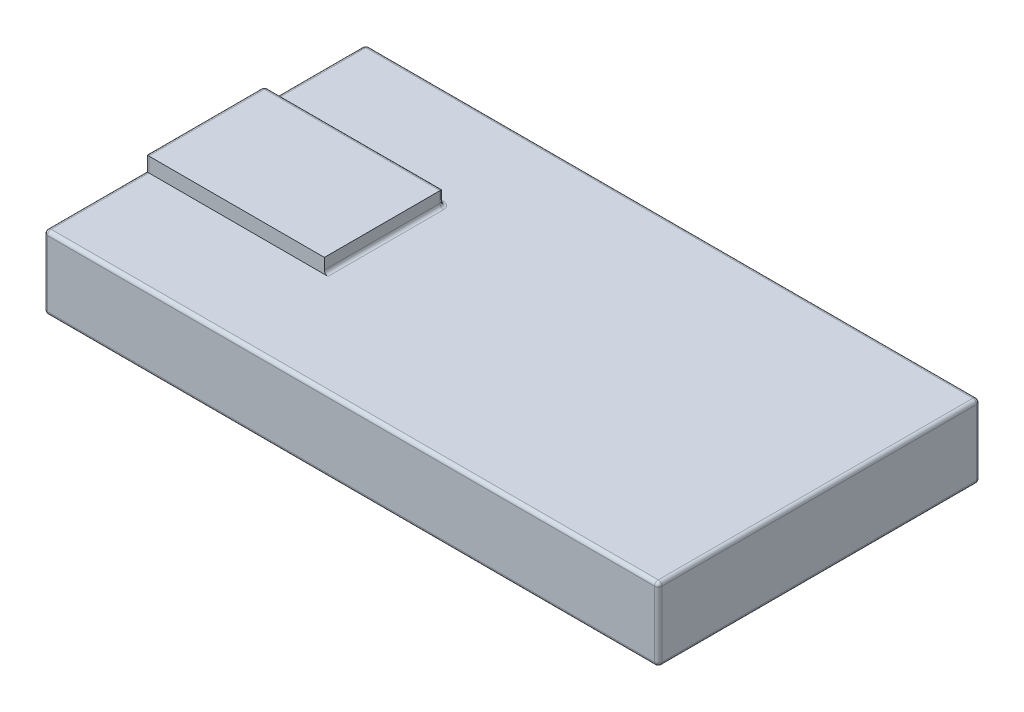
ISO-10303-21;
HEADER;
FILE_DESCRIPTION(('STEP AP214'),'2;1');
FILE_NAME('part.step','',(''),(''),'','','');
FILE_SCHEMA(('AUTOMOTIVE_DESIGN { 1 0 10303 214 1 1 1 1 }'));
ENDSEC;
DATA;
#1=APPLICATION_CONTEXT('core data for automotive mechanical design processes');
#2=APPLICATION_PROTOCOL_DEFINITION('international standard','automotive_design',2000,#1);
#3=PRODUCT_CONTEXT('',#1,'mechanical');
#4=PRODUCT('Part','Part','',(#3));
#5=PRODUCT_RELATED_PRODUCT_CATEGORY('part','',(#4));
#6=PRODUCT_DEFINITION_FORMATION('','',#4);
#7=PRODUCT_DEFINITION_CONTEXT('part definition',#1,'design');
#8=PRODUCT_DEFINITION('design','',#6,#7);
#9=PRODUCT_DEFINITION_SHAPE('','',#8);
#10=(LENGTH_UNIT() NAMED_UNIT(*) SI_UNIT(.MILLI.,.METRE.));
#11=(NAMED_UNIT(*) PLANE_ANGLE_UNIT() SI_UNIT($,.RADIAN.));
#12=(NAMED_UNIT(*) SI_UNIT($,.STERADIAN.) SOLID_ANGLE_UNIT());
#13=UNCERTAINTY_MEASURE_WITH_UNIT(LENGTH_MEASURE(1.E-05),#10,'distance_accuracy_value','');
#14=(GEOMETRIC_REPRESENTATION_CONTEXT(3) GLOBAL_UNCERTAINTY_ASSIGNED_CONTEXT((#13)) GLOBAL_UNIT_ASSIGNED_CONTEXT((#10,
#11,#12)) REPRESENTATION_CONTEXT('',''));
#15=CARTESIAN_POINT('',(0.,0.,0.));
#16=DIRECTION('',(0.,0.,1.));
#17=DIRECTION('',(1.,0.,0.));
#18=AXIS2_PLACEMENT_3D('',#15,#16,#17);
#19=CARTESIAN_POINT('',(42.,10.,-22.));
#20=DIRECTION('',(-1.,0.,0.));
#21=DIRECTION('',(0.,0.,1.));
#22=AXIS2_PLACEMENT_3D('',#19,#20,#21);
#23=PLANE('',#22);
#24=DIRECTION('',(0.,0.,-1.));
#25=VECTOR('',#24,1.);
#26=CARTESIAN_POINT('',(42.,0.5,-22.));
#27=LINE('',#26,#25);
#28=CARTESIAN_POINT('',(42.,0.5,21.5));
#29=VERTEX_POINT('',#28);
#30=CARTESIAN_POINT('',(42.,0.5,-21.5));
#31=VERTEX_POINT('',#30);
#32=EDGE_CURVE('E302',#29,#31,#27,.T.);
#33=ORIENTED_EDGE('',*,*,#32,.T.);
#34=DIRECTION('',(0.,-1.,0.));
#35=VECTOR('',#34,1.);
#36=CARTESIAN_POINT('',(42.,10.,-21.5));
#37=LINE('',#36,#35);
#38=CARTESIAN_POINT('',(42.,9.5,-21.5));
#39=VERTEX_POINT('',#38);
#40=EDGE_CURVE('E304',#31,#39,#37,.F.);
#41=ORIENTED_EDGE('',*,*,#40,.T.);
#42=DIRECTION('',(0.,0.,-1.));
#43=VECTOR('',#42,1.);
#44=CARTESIAN_POINT('',(42.,9.5,22.));
#45=LINE('',#44,#43);
#46=CARTESIAN_POINT('',(42.,9.5,21.5));
#47=VERTEX_POINT('',#46);
#48=EDGE_CURVE('E212',#39,#47,#45,.F.);
#49=ORIENTED_EDGE('',*,*,#48,.T.);
#50=DIRECTION('',(0.,-1.,0.));
#51=VECTOR('',#50,1.);
#52=CARTESIAN_POINT('',(42.,10.,21.5));
#53=LINE('',#52,#51);
#54=EDGE_CURVE('E214',#47,#29,#53,.T.);
#55=ORIENTED_EDGE('',*,*,#54,.T.);
#56=EDGE_LOOP('',(#33,#41,#49,#55));
#57=FACE_BOUND('',#56,.T.);
#58=ADVANCED_FACE('F39',(#57),#23,.F.);
#59=CARTESIAN_POINT('',(-42.,10.,-22.));
#60=DIRECTION('',(0.,0.,1.));
#61=DIRECTION('',(1.,0.,0.));
#62=AXIS2_PLACEMENT_3D('',#59,#60,#61);
#63=PLANE('',#62);
#64=DIRECTION('',(0.,-1.,0.));
#65=VECTOR('',#64,1.);
#66=CARTESIAN_POINT('',(-41.5,10.,-22.));
#67=LINE('',#66,#65);
#68=CARTESIAN_POINT('',(-41.5,0.5,-22.));
#69=VERTEX_POINT('',#68);
#70=CARTESIAN_POINT('',(-41.5,9.5,-22.));
#71=VERTEX_POINT('',#70);
#72=EDGE_CURVE('E257',#69,#71,#67,.F.);
#73=ORIENTED_EDGE('',*,*,#72,.T.);
#74=DIRECTION('',(-1.,0.,0.));
#75=VECTOR('',#74,1.);
#76=CARTESIAN_POINT('',(41.5,9.5,-22.));
#77=LINE('',#76,#75);
#78=CARTESIAN_POINT('',(41.5,9.5,-22.));
#79=VERTEX_POINT('',#78);
#80=EDGE_CURVE('E261',#71,#79,#77,.F.);
#81=ORIENTED_EDGE('',*,*,#80,.T.);
#82=DIRECTION('',(0.,-1.,0.));
#83=VECTOR('',#82,1.);
#84=CARTESIAN_POINT('',(41.5,10.,-22.));
#85=LINE('',#84,#83);
#86=CARTESIAN_POINT('',(41.5,0.5,-22.));
#87=VERTEX_POINT('',#86);
#88=EDGE_CURVE('E259',#79,#87,#85,.T.);
#89=ORIENTED_EDGE('',*,*,#88,.T.);
#90=DIRECTION('',(-1.,0.,0.));
#91=VECTOR('',#90,1.);
#92=CARTESIAN_POINT('',(-42.,0.5,-22.));
#93=LINE('',#92,#91);
#94=EDGE_CURVE('E255',#87,#69,#93,.T.);
#95=ORIENTED_EDGE('',*,*,#94,.T.);
#96=EDGE_LOOP('',(#73,#81,#89,#95));
#97=FACE_BOUND('',#96,.T.);
#98=ADVANCED_FACE('F460',(#97),#63,.F.);
#99=CARTESIAN_POINT('',(-42.,10.,-22.));
#100=DIRECTION('',(1.,0.,0.));
#101=DIRECTION('',(0.,0.,-1.));
#102=AXIS2_PLACEMENT_3D('',#99,#100,#101);
#103=PLANE('',#102);
#104=DIRECTION('',(0.,0.,1.));
#105=VECTOR('',#104,1.);
#106=CARTESIAN_POINT('',(-42.,0.5,-22.));
#107=LINE('',#106,#105);
#108=CARTESIAN_POINT('',(-42.,0.5,-21.5));
#109=VERTEX_POINT('',#108);
#110=CARTESIAN_POINT('',(-42.,0.5,21.5));
#111=VERTEX_POINT('',#110);
#112=EDGE_CURVE('E281',#109,#111,#107,.T.);
#113=ORIENTED_EDGE('',*,*,#112,.T.);
#114=DIRECTION('',(0.,-1.,0.));
#115=VECTOR('',#114,1.);
#116=CARTESIAN_POINT('',(-42.,10.,21.5));
#117=LINE('',#116,#115);
#118=CARTESIAN_POINT('',(-42.,9.5,21.5));
#119=VERTEX_POINT('',#118);
#120=EDGE_CURVE('E290',#111,#119,#117,.F.);
#121=ORIENTED_EDGE('',*,*,#120,.T.);
#122=DIRECTION('',(0.,0.,1.));
#123=VECTOR('',#122,1.);
#124=CARTESIAN_POINT('',(-42.,9.5,8.15));
#125=LINE('',#124,#123);
#126=CARTESIAN_POINT('',(-42.,9.5,7.65));
#127=VERTEX_POINT('',#126);
#128=EDGE_CURVE('E288',#119,#127,#125,.F.);
#129=ORIENTED_EDGE('',*,*,#128,.T.);
#130=DIRECTION('',(0.,-1.,0.));
#131=VECTOR('',#130,1.);
#132=CARTESIAN_POINT('',(-42.,10.,7.65));
#133=LINE('',#132,#131);
#134=CARTESIAN_POINT('',(-42.,11.5,7.65));
#135=VERTEX_POINT('',#134);
#136=EDGE_CURVE('E286',#127,#135,#133,.F.);
#137=ORIENTED_EDGE('',*,*,#136,.T.);
#138=DIRECTION('',(0.,0.,1.));
#139=VECTOR('',#138,1.);
#140=CARTESIAN_POINT('',(-42.,11.5,-8.15));
#141=LINE('',#140,#139);
#142=CARTESIAN_POINT('',(-42.,11.5,-7.65));
#143=VERTEX_POINT('',#142);
#144=EDGE_CURVE('E284',#135,#143,#141,.F.);
#145=ORIENTED_EDGE('',*,*,#144,.T.);
#146=DIRECTION('',(0.,-1.,0.));
#147=VECTOR('',#146,1.);
#148=CARTESIAN_POINT('',(-42.,10.,-7.65));
#149=LINE('',#148,#147);
#150=CARTESIAN_POINT('',(-42.,10.5,-7.65));
#151=VERTEX_POINT('',#150);
#152=EDGE_CURVE('E279',#143,#151,#149,.T.);
#153=ORIENTED_EDGE('',*,*,#152,.T.);
#154=CARTESIAN_POINT('',(-42.,10.5,-8.65));
#155=DIRECTION('',(1.,0.,0.));
#156=DIRECTION('',(0.,0.,-1.));
#157=AXIS2_PLACEMENT_3D('',#154,#155,#156);
#158=CIRCLE('',#157,1.);
#159=CARTESIAN_POINT('',(-42.,9.5,-8.65));
#160=VERTEX_POINT('',#159);
#161=EDGE_CURVE('E276',#160,#151,#158,.F.);
#162=ORIENTED_EDGE('',*,*,#161,.F.);
#163=DIRECTION('',(0.,0.,1.));
#164=VECTOR('',#163,1.);
#165=CARTESIAN_POINT('',(-42.,9.5,-22.));
#166=LINE('',#165,#164);
#167=CARTESIAN_POINT('',(-42.,9.5,-21.5));
#168=VERTEX_POINT('',#167);
#169=EDGE_CURVE('E274',#160,#168,#166,.F.);
#170=ORIENTED_EDGE('',*,*,#169,.T.);
#171=DIRECTION('',(0.,-1.,0.));
#172=VECTOR('',#171,1.);
#173=CARTESIAN_POINT('',(-42.,10.,-21.5));
#174=LINE('',#173,#172);
#175=EDGE_CURVE('E272',#168,#109,#174,.T.);
#176=ORIENTED_EDGE('',*,*,#175,.T.);
#177=EDGE_LOOP('',(#113,#121,#129,#137,#145,#153,#162,#170,#176));
#178=FACE_BOUND('',#177,.T.);
#179=ADVANCED_FACE('F442',(#178),#103,.F.);
#180=CARTESIAN_POINT('',(-42.,10.,22.));
#181=DIRECTION('',(0.,0.,-1.));
#182=DIRECTION('',(-1.,0.,0.));
#183=AXIS2_PLACEMENT_3D('',#180,#181,#182);
#184=PLANE('',#183);
#185=DIRECTION('',(1.,0.,0.));
#186=VECTOR('',#185,1.);
#187=CARTESIAN_POINT('',(-42.,9.5,22.));
#188=LINE('',#187,#186);
#189=CARTESIAN_POINT('',(41.5,9.5,22.));
#190=VERTEX_POINT('',#189);
#191=CARTESIAN_POINT('',(-41.5,9.5,22.));
#192=VERTEX_POINT('',#191);
#193=EDGE_CURVE('E222',#190,#192,#188,.F.);
#194=ORIENTED_EDGE('',*,*,#193,.T.);
#195=DIRECTION('',(0.,-1.,0.));
#196=VECTOR('',#195,1.);
#197=CARTESIAN_POINT('',(-41.5,10.,22.));
#198=LINE('',#197,#196);
#199=CARTESIAN_POINT('',(-41.5,0.5,22.));
#200=VERTEX_POINT('',#199);
#201=EDGE_CURVE('E298',#192,#200,#198,.T.);
#202=ORIENTED_EDGE('',*,*,#201,.T.);
#203=DIRECTION('',(1.,0.,0.));
#204=VECTOR('',#203,1.);
#205=CARTESIAN_POINT('',(-42.,0.5,22.));
#206=LINE('',#205,#204);
#207=CARTESIAN_POINT('',(41.5,0.5,22.));
#208=VERTEX_POINT('',#207);
#209=EDGE_CURVE('E217',#200,#208,#206,.T.);
#210=ORIENTED_EDGE('',*,*,#209,.T.);
#211=DIRECTION('',(0.,-1.,0.));
#212=VECTOR('',#211,1.);
#213=CARTESIAN_POINT('',(41.5,10.,22.));
#214=LINE('',#213,#212);
#215=EDGE_CURVE('E220',#208,#190,#214,.F.);
#216=ORIENTED_EDGE('',*,*,#215,.T.);
#217=EDGE_LOOP('',(#194,#202,#210,#216));
#218=FACE_BOUND('',#217,.T.);
#219=ADVANCED_FACE('F414',(#218),#184,.F.);
#220=CARTESIAN_POINT('',(0.,10.,0.));
#221=DIRECTION('',(0.,1.,0.));
#222=DIRECTION('',(0.,0.,1.));
#223=AXIS2_PLACEMENT_3D('',#220,#221,#222);
#224=PLANE('',#223);
#225=DIRECTION('',(1.,0.,0.));
#226=VECTOR('',#225,1.);
#227=CARTESIAN_POINT('',(-42.,10.,8.15));
#228=LINE('',#227,#226);
#229=CARTESIAN_POINT('',(-41.5,10.,8.15));
#230=VERTEX_POINT('',#229);
#231=CARTESIAN_POINT('',(-17.,10.,8.15));
#232=VERTEX_POINT('',#231);
#233=EDGE_CURVE('E192',#230,#232,#228,.T.);
#234=ORIENTED_EDGE('',*,*,#233,.F.);
#235=DIRECTION('',(0.,0.,1.));
#236=VECTOR('',#235,1.);
#237=CARTESIAN_POINT('',(-41.5,10.,21.5));
#238=LINE('',#237,#236);
#239=CARTESIAN_POINT('',(-41.5,10.,21.5));
#240=VERTEX_POINT('',#239);
#241=EDGE_CURVE('E253',#230,#240,#238,.T.);
#242=ORIENTED_EDGE('',*,*,#241,.T.);
#243=DIRECTION('',(1.,0.,0.));
#244=VECTOR('',#243,1.);
#245=CARTESIAN_POINT('',(41.5,10.,21.5));
#246=LINE('',#245,#244);
#247=CARTESIAN_POINT('',(41.5,10.,21.5));
#248=VERTEX_POINT('',#247);
#249=EDGE_CURVE('E228',#240,#248,#246,.T.);
#250=ORIENTED_EDGE('',*,*,#249,.T.);
#251=DIRECTION('',(0.,0.,-1.));
#252=VECTOR('',#251,1.);
#253=CARTESIAN_POINT('',(41.5,10.,-22.));
#254=LINE('',#253,#252);
#255=CARTESIAN_POINT('',(41.5,10.,-21.5));
#256=VERTEX_POINT('',#255);
#257=EDGE_CURVE('E201',#248,#256,#254,.T.);
#258=ORIENTED_EDGE('',*,*,#257,.T.);
#259=DIRECTION('',(-1.,0.,0.));
#260=VECTOR('',#259,1.);
#261=CARTESIAN_POINT('',(-42.,10.,-21.5));
#262=LINE('',#261,#260);
#263=CARTESIAN_POINT('',(-41.5,10.,-21.5));
#264=VERTEX_POINT('',#263);
#265=EDGE_CURVE('E245',#256,#264,#262,.T.);
#266=ORIENTED_EDGE('',*,*,#265,.T.);
#267=DIRECTION('',(0.,0.,1.));
#268=VECTOR('',#267,1.);
#269=CARTESIAN_POINT('',(-41.5,10.,-8.15));
#270=LINE('',#269,#268);
#271=CARTESIAN_POINT('',(-41.5,10.,-8.65));
#272=VERTEX_POINT('',#271);
#273=EDGE_CURVE('E241',#264,#272,#270,.T.);
#274=ORIENTED_EDGE('',*,*,#273,.T.);
#275=DIRECTION('',(-1.,0.,0.));
#276=VECTOR('',#275,1.);
#277=CARTESIAN_POINT('',(0.,10.,-8.65000000000001));
#278=LINE('',#277,#276);
#279=CARTESIAN_POINT('',(-18.,10.,-8.65));
#280=VERTEX_POINT('',#279);
#281=EDGE_CURVE('E243',#272,#280,#278,.F.);
#282=ORIENTED_EDGE('',*,*,#281,.T.);
#283=CARTESIAN_POINT('',(-18.,10.,-7.65));
#284=DIRECTION('',(0.,1.,0.));
#285=DIRECTION('',(0.,0.,1.));
#286=AXIS2_PLACEMENT_3D('',#283,#284,#285);
#287=CIRCLE('',#286,1.);
#288=CARTESIAN_POINT('',(-17.,10.,-7.65));
#289=VERTEX_POINT('',#288);
#290=EDGE_CURVE('E247',#289,#280,#287,.T.);
#291=ORIENTED_EDGE('',*,*,#290,.F.);
#292=DIRECTION('',(0.,0.,-1.));
#293=VECTOR('',#292,1.);
#294=CARTESIAN_POINT('',(-17.,10.,0.));
#295=LINE('',#294,#293);
#296=EDGE_CURVE('E250',#289,#232,#295,.F.);
#297=ORIENTED_EDGE('',*,*,#296,.T.);
#298=EDGE_LOOP('',(#234,#242,#250,#258,#266,#274,#282,#291,#297));
#299=FACE_BOUND('',#298,.T.);
#300=ADVANCED_FACE('F884',(#299),#224,.T.);
#301=CARTESIAN_POINT('',(0.,0.,0.));
#302=DIRECTION('',(0.,1.,0.));
#303=DIRECTION('',(0.,0.,1.));
#304=AXIS2_PLACEMENT_3D('',#301,#302,#303);
#305=PLANE('',#304);
#306=DIRECTION('',(1.,0.,0.));
#307=VECTOR('',#306,1.);
#308=CARTESIAN_POINT('',(0.,0.,21.5));
#309=LINE('',#308,#307);
#310=CARTESIAN_POINT('',(41.5,0.,21.5));
#311=VERTEX_POINT('',#310);
#312=CARTESIAN_POINT('',(-41.5,0.,21.5));
#313=VERTEX_POINT('',#312);
#314=EDGE_CURVE('E230',#311,#313,#309,.F.);
#315=ORIENTED_EDGE('',*,*,#314,.T.);
#316=DIRECTION('',(0.,0.,1.));
#317=VECTOR('',#316,1.);
#318=CARTESIAN_POINT('',(-41.5,0.,0.));
#319=LINE('',#318,#317);
#320=CARTESIAN_POINT('',(-41.5,0.,-21.5));
#321=VERTEX_POINT('',#320);
#322=EDGE_CURVE('E296',#313,#321,#319,.F.);
#323=ORIENTED_EDGE('',*,*,#322,.T.);
#324=DIRECTION('',(-1.,0.,0.));
#325=VECTOR('',#324,1.);
#326=CARTESIAN_POINT('',(0.,0.,-21.5));
#327=LINE('',#326,#325);
#328=CARTESIAN_POINT('',(41.5,0.,-21.5));
#329=VERTEX_POINT('',#328);
#330=EDGE_CURVE('E292',#321,#329,#327,.F.);
#331=ORIENTED_EDGE('',*,*,#330,.T.);
#332=DIRECTION('',(0.,0.,-1.));
#333=VECTOR('',#332,1.);
#334=CARTESIAN_POINT('',(41.5,0.,0.));
#335=LINE('',#334,#333);
#336=EDGE_CURVE('E294',#329,#311,#335,.F.);
#337=ORIENTED_EDGE('',*,*,#336,.T.);
#338=EDGE_LOOP('',(#315,#323,#331,#337));
#339=FACE_BOUND('',#338,.T.);
#340=ADVANCED_FACE('F484',(#339),#305,.F.);
#341=CARTESIAN_POINT('',(-42.,12.,8.15));
#342=DIRECTION('',(0.,0.,-1.));
#343=DIRECTION('',(-1.,0.,0.));
#344=AXIS2_PLACEMENT_3D('',#341,#342,#343);
#345=PLANE('',#344);
#346=DIRECTION('',(1.,0.,0.));
#347=VECTOR('',#346,1.);
#348=CARTESIAN_POINT('',(-42.,12.,8.15));
#349=LINE('',#348,#347);
#350=CARTESIAN_POINT('',(-41.5,12.,8.15));
#351=VERTEX_POINT('',#350);
#352=CARTESIAN_POINT('',(-17.5,12.,8.15));
#353=VERTEX_POINT('',#352);
#354=EDGE_CURVE('E185',#351,#353,#349,.T.);
#355=ORIENTED_EDGE('',*,*,#354,.F.);
#356=DIRECTION('',(0.,-1.,0.));
#357=VECTOR('',#356,1.);
#358=CARTESIAN_POINT('',(-41.5,12.,8.15));
#359=LINE('',#358,#357);
#360=EDGE_CURVE('E48',#351,#230,#359,.T.);
#361=ORIENTED_EDGE('',*,*,#360,.T.);
#362=ORIENTED_EDGE('',*,*,#233,.T.);
#363=CARTESIAN_POINT('',(-17.,10.5,8.15));
#364=DIRECTION('',(0.,0.,-1.));
#365=DIRECTION('',(-1.,0.,0.));
#366=AXIS2_PLACEMENT_3D('',#363,#364,#365);
#367=CIRCLE('',#366,0.5);
#368=CARTESIAN_POINT('',(-17.5,10.5,8.15));
#369=VERTEX_POINT('',#368);
#370=EDGE_CURVE('E11',#232,#369,#367,.T.);
#371=ORIENTED_EDGE('',*,*,#370,.T.);
#372=DIRECTION('',(0.,-1.,0.));
#373=VECTOR('',#372,1.);
#374=CARTESIAN_POINT('',(-17.5,12.,8.15));
#375=LINE('',#374,#373);
#376=EDGE_CURVE('E195',#353,#369,#375,.T.);
#377=ORIENTED_EDGE('',*,*,#376,.F.);
#378=EDGE_LOOP('',(#355,#361,#362,#371,#377));
#379=FACE_BOUND('',#378,.T.);
#380=ADVANCED_FACE('F196',(#379),#345,.F.);
#381=CARTESIAN_POINT('',(-17.5,12.,8.15));
#382=DIRECTION('',(-1.,0.,0.));
#383=DIRECTION('',(0.,0.,1.));
#384=AXIS2_PLACEMENT_3D('',#381,#382,#383);
#385=PLANE('',#384);
#386=ORIENTED_EDGE('',*,*,#376,.T.);
#387=DIRECTION('',(0.,0.,-1.));
#388=VECTOR('',#387,1.);
#389=CARTESIAN_POINT('',(-17.5,10.5,8.15));
#390=LINE('',#389,#388);
#391=CARTESIAN_POINT('',(-17.5,10.5,-7.65));
#392=VERTEX_POINT('',#391);
#393=EDGE_CURVE('E239',#369,#392,#390,.T.);
#394=ORIENTED_EDGE('',*,*,#393,.T.);
#395=DIRECTION('',(0.,-1.,0.));
#396=VECTOR('',#395,1.);
#397=CARTESIAN_POINT('',(-17.5,12.,-7.65));
#398=LINE('',#397,#396);
#399=CARTESIAN_POINT('',(-17.5,12.,-7.65));
#400=VERTEX_POINT('',#399);
#401=EDGE_CURVE('E205',#392,#400,#398,.F.);
#402=ORIENTED_EDGE('',*,*,#401,.T.);
#403=DIRECTION('',(0.,0.,-1.));
#404=VECTOR('',#403,1.);
#405=CARTESIAN_POINT('',(-17.5,12.,8.15));
#406=LINE('',#405,#404);
#407=EDGE_CURVE('E189',#353,#400,#406,.T.);
#408=ORIENTED_EDGE('',*,*,#407,.F.);
#409=EDGE_LOOP('',(#386,#394,#402,#408));
#410=FACE_BOUND('',#409,.T.);
#411=ADVANCED_FACE('F203',(#410),#385,.F.);
#412=CARTESIAN_POINT('',(-17.5,12.,-8.15));
#413=DIRECTION('',(0.,0.,1.));
#414=DIRECTION('',(1.,0.,0.));
#415=AXIS2_PLACEMENT_3D('',#412,#413,#414);
#416=PLANE('',#415);
#417=DIRECTION('',(-1.,0.,0.));
#418=VECTOR('',#417,1.);
#419=CARTESIAN_POINT('',(-17.5,11.5,-8.15));
#420=LINE('',#419,#418);
#421=CARTESIAN_POINT('',(-41.5,11.5,-8.15));
#422=VERTEX_POINT('',#421);
#423=CARTESIAN_POINT('',(-18.,11.5,-8.15));
#424=VERTEX_POINT('',#423);
#425=EDGE_CURVE('E310',#422,#424,#420,.F.);
#426=ORIENTED_EDGE('',*,*,#425,.T.);
#427=DIRECTION('',(0.,-1.,0.));
#428=VECTOR('',#427,1.);
#429=CARTESIAN_POINT('',(-18.,12.,-8.15));
#430=LINE('',#429,#428);
#431=CARTESIAN_POINT('',(-18.,10.5,-8.15));
#432=VERTEX_POINT('',#431);
#433=EDGE_CURVE('E312',#424,#432,#430,.T.);
#434=ORIENTED_EDGE('',*,*,#433,.T.);
#435=DIRECTION('',(-1.,0.,0.));
#436=VECTOR('',#435,1.);
#437=CARTESIAN_POINT('',(-17.5,10.5,-8.15));
#438=LINE('',#437,#436);
#439=CARTESIAN_POINT('',(-41.5,10.5,-8.15));
#440=VERTEX_POINT('',#439);
#441=EDGE_CURVE('E306',#432,#440,#438,.T.);
#442=ORIENTED_EDGE('',*,*,#441,.T.);
#443=DIRECTION('',(0.,-1.,0.));
#444=VECTOR('',#443,1.);
#445=CARTESIAN_POINT('',(-41.5,12.,-8.15));
#446=LINE('',#445,#444);
#447=EDGE_CURVE('E308',#440,#422,#446,.F.);
#448=ORIENTED_EDGE('',*,*,#447,.T.);
#449=EDGE_LOOP('',(#426,#434,#442,#448));
#450=FACE_BOUND('',#449,.T.);
#451=ADVANCED_FACE('F832',(#450),#416,.F.);
#452=CARTESIAN_POINT('',(0.,12.,0.));
#453=DIRECTION('',(0.,1.,0.));
#454=DIRECTION('',(0.,0.,1.));
#455=AXIS2_PLACEMENT_3D('',#452,#453,#454);
#456=PLANE('',#455);
#457=ORIENTED_EDGE('',*,*,#407,.T.);
#458=DIRECTION('',(-1.,0.,0.));
#459=VECTOR('',#458,1.);
#460=CARTESIAN_POINT('',(-42.,12.,-7.65));
#461=LINE('',#460,#459);
#462=CARTESIAN_POINT('',(-41.5,12.,-7.65));
#463=VERTEX_POINT('',#462);
#464=EDGE_CURVE('E56',#400,#463,#461,.T.);
#465=ORIENTED_EDGE('',*,*,#464,.T.);
#466=DIRECTION('',(0.,0.,1.));
#467=VECTOR('',#466,1.);
#468=CARTESIAN_POINT('',(-41.5,12.,8.15));
#469=LINE('',#468,#467);
#470=EDGE_CURVE('E60',#463,#351,#469,.T.);
#471=ORIENTED_EDGE('',*,*,#470,.T.);
#472=ORIENTED_EDGE('',*,*,#354,.T.);
#473=EDGE_LOOP('',(#457,#465,#471,#472));
#474=FACE_BOUND('',#473,.T.);
#475=ADVANCED_FACE('F187',(#474),#456,.T.);
#476=CARTESIAN_POINT('',(41.5,9.5,0.));
#477=DIRECTION('',(0.,0.,1.));
#478=DIRECTION('',(1.,0.,0.));
#479=AXIS2_PLACEMENT_3D('',#476,#477,#478);
#480=CYLINDRICAL_SURFACE('',#479,0.5);
#481=ORIENTED_EDGE('',*,*,#48,.F.);
#482=CARTESIAN_POINT('',(41.5,9.5,-21.5));
#483=DIRECTION('',(0.,0.,1.));
#484=DIRECTION('',(1.,0.,0.));
#485=AXIS2_PLACEMENT_3D('',#482,#483,#484);
#486=CIRCLE('',#485,0.5);
#487=EDGE_CURVE('E264',#39,#256,#486,.T.);
#488=ORIENTED_EDGE('',*,*,#487,.T.);
#489=ORIENTED_EDGE('',*,*,#257,.F.);
#490=CARTESIAN_POINT('',(41.5,9.5,21.5));
#491=DIRECTION('',(0.,0.,1.));
#492=DIRECTION('',(1.,0.,0.));
#493=AXIS2_PLACEMENT_3D('',#490,#491,#492);
#494=CIRCLE('',#493,0.5);
#495=EDGE_CURVE('E225',#248,#47,#494,.F.);
#496=ORIENTED_EDGE('',*,*,#495,.T.);
#497=EDGE_LOOP('',(#481,#488,#489,#496));
#498=FACE_BOUND('',#497,.T.);
#499=ADVANCED_FACE('F503',(#498),#480,.T.);
#500=CARTESIAN_POINT('',(0.,9.5,21.5));
#501=DIRECTION('',(-1.,0.,0.));
#502=DIRECTION('',(0.,0.,1.));
#503=AXIS2_PLACEMENT_3D('',#500,#501,#502);
#504=CYLINDRICAL_SURFACE('',#503,0.5);
#505=ORIENTED_EDGE('',*,*,#249,.F.);
#506=CARTESIAN_POINT('',(-41.5,9.5,21.5));
#507=DIRECTION('',(-1.,0.,0.));
#508=DIRECTION('',(0.,0.,1.));
#509=AXIS2_PLACEMENT_3D('',#506,#507,#508);
#510=CIRCLE('',#509,0.5);
#511=EDGE_CURVE('E300',#240,#192,#510,.F.);
#512=ORIENTED_EDGE('',*,*,#511,.T.);
#513=ORIENTED_EDGE('',*,*,#193,.F.);
#514=CARTESIAN_POINT('',(41.5,9.5,21.5));
#515=DIRECTION('',(1.,0.,0.));
#516=DIRECTION('',(0.,0.,-1.));
#517=AXIS2_PLACEMENT_3D('',#514,#515,#516);
#518=CIRCLE('',#517,0.5);
#519=EDGE_CURVE('E208',#248,#190,#518,.T.);
#520=ORIENTED_EDGE('',*,*,#519,.F.);
#521=EDGE_LOOP('',(#505,#512,#513,#520));
#522=FACE_BOUND('',#521,.T.);
#523=ADVANCED_FACE('F427',(#522),#504,.T.);
#524=CARTESIAN_POINT('',(41.5,9.5,21.5));
#525=DIRECTION('',(0.,0.,-1.));
#526=DIRECTION('',(-1.,0.,0.));
#527=AXIS2_PLACEMENT_3D('',#524,#525,#526);
#528=SPHERICAL_SURFACE('',#527,0.5);
#529=ORIENTED_EDGE('',*,*,#495,.F.);
#530=ORIENTED_EDGE('',*,*,#519,.T.);
#531=CARTESIAN_POINT('',(41.5,9.5,21.5));
#532=DIRECTION('',(0.,-1.,0.));
#533=DIRECTION('',(0.,0.,-1.));
#534=AXIS2_PLACEMENT_3D('',#531,#532,#533);
#535=CIRCLE('',#534,0.5);
#536=EDGE_CURVE('E233',#47,#190,#535,.T.);
#537=ORIENTED_EDGE('',*,*,#536,.F.);
#538=EDGE_LOOP('',(#529,#530,#537));
#539=FACE_BOUND('',#538,.T.);
#540=ADVANCED_FACE('F423',(#539),#528,.T.);
#541=CARTESIAN_POINT('',(-42.,0.5,21.5));
#542=DIRECTION('',(1.,0.,0.));
#543=DIRECTION('',(0.,0.,-1.));
#544=AXIS2_PLACEMENT_3D('',#541,#542,#543);
#545=CYLINDRICAL_SURFACE('',#544,0.5);
#546=ORIENTED_EDGE('',*,*,#314,.F.);
#547=CARTESIAN_POINT('',(41.5,0.5,21.5));
#548=DIRECTION('',(1.,0.,0.));
#549=DIRECTION('',(0.,0.,-1.));
#550=AXIS2_PLACEMENT_3D('',#547,#548,#549);
#551=CIRCLE('',#550,0.5);
#552=EDGE_CURVE('E270',#311,#208,#551,.F.);
#553=ORIENTED_EDGE('',*,*,#552,.T.);
#554=ORIENTED_EDGE('',*,*,#209,.F.);
#555=CARTESIAN_POINT('',(-41.5,0.5,21.5));
#556=DIRECTION('',(1.,0.,0.));
#557=DIRECTION('',(0.,0.,-1.));
#558=AXIS2_PLACEMENT_3D('',#555,#556,#557);
#559=CIRCLE('',#558,0.5);
#560=EDGE_CURVE('E268',#200,#313,#559,.T.);
#561=ORIENTED_EDGE('',*,*,#560,.T.);
#562=EDGE_LOOP('',(#546,#553,#554,#561));
#563=FACE_BOUND('',#562,.T.);
#564=ADVANCED_FACE('F411',(#563),#545,.T.);
#565=CARTESIAN_POINT('',(41.5,10.,21.5));
#566=DIRECTION('',(0.,-1.,0.));
#567=DIRECTION('',(0.,0.,-1.));
#568=AXIS2_PLACEMENT_3D('',#565,#566,#567);
#569=CYLINDRICAL_SURFACE('',#568,0.5);
#570=ORIENTED_EDGE('',*,*,#215,.F.);
#571=CARTESIAN_POINT('',(41.5,0.5,21.5));
#572=DIRECTION('',(0.,-1.,0.));
#573=DIRECTION('',(0.,0.,-1.));
#574=AXIS2_PLACEMENT_3D('',#571,#572,#573);
#575=CIRCLE('',#574,0.5);
#576=EDGE_CURVE('E266',#208,#29,#575,.F.);
#577=ORIENTED_EDGE('',*,*,#576,.T.);
#578=ORIENTED_EDGE('',*,*,#54,.F.);
#579=ORIENTED_EDGE('',*,*,#536,.T.);
#580=EDGE_LOOP('',(#570,#577,#578,#579));
#581=FACE_BOUND('',#580,.T.);
#582=ADVANCED_FACE('F418',(#581),#569,.T.);
#583=CARTESIAN_POINT('',(41.5,0.5,21.5));
#584=DIRECTION('',(0.,0.,1.));
#585=DIRECTION('',(1.,0.,0.));
#586=AXIS2_PLACEMENT_3D('',#583,#584,#585);
#587=SPHERICAL_SURFACE('',#586,0.5);
#588=ORIENTED_EDGE('',*,*,#576,.F.);
#589=ORIENTED_EDGE('',*,*,#552,.F.);
#590=CARTESIAN_POINT('',(41.5,0.5,21.5));
#591=DIRECTION('',(0.,0.,-1.));
#592=DIRECTION('',(-1.,0.,0.));
#593=AXIS2_PLACEMENT_3D('',#590,#591,#592);
#594=CIRCLE('',#593,0.5);
#595=EDGE_CURVE('E43',#29,#311,#594,.T.);
#596=ORIENTED_EDGE('',*,*,#595,.F.);
#597=EDGE_LOOP('',(#588,#589,#596));
#598=FACE_BOUND('',#597,.T.);
#599=ADVANCED_FACE('F41',(#598),#587,.T.);
#600=CARTESIAN_POINT('',(41.5,0.5,-22.));
#601=DIRECTION('',(0.,0.,-1.));
#602=DIRECTION('',(-1.,0.,0.));
#603=AXIS2_PLACEMENT_3D('',#600,#601,#602);
#604=CYLINDRICAL_SURFACE('',#603,0.5);
#605=ORIENTED_EDGE('',*,*,#595,.T.);
#606=ORIENTED_EDGE('',*,*,#336,.F.);
#607=CARTESIAN_POINT('',(41.5,0.5,-21.5));
#608=DIRECTION('',(0.,0.,-1.));
#609=DIRECTION('',(-1.,0.,0.));
#610=AXIS2_PLACEMENT_3D('',#607,#608,#609);
#611=CIRCLE('',#610,0.5);
#612=EDGE_CURVE('E389',#31,#329,#611,.T.);
#613=ORIENTED_EDGE('',*,*,#612,.F.);
#614=ORIENTED_EDGE('',*,*,#32,.F.);
#615=EDGE_LOOP('',(#605,#606,#613,#614));
#616=FACE_BOUND('',#615,.T.);
#617=ADVANCED_FACE('F403',(#616),#604,.T.);
#618=CARTESIAN_POINT('',(-41.5,10.,21.5));
#619=DIRECTION('',(0.,-1.,0.));
#620=DIRECTION('',(0.,0.,-1.));
#621=AXIS2_PLACEMENT_3D('',#618,#619,#620);
#622=CYLINDRICAL_SURFACE('',#621,0.5);
#623=CARTESIAN_POINT('',(-41.5,0.5,21.5));
#624=DIRECTION('',(0.,-1.,0.));
#625=DIRECTION('',(0.,0.,-1.));
#626=AXIS2_PLACEMENT_3D('',#623,#624,#625);
#627=CIRCLE('',#626,0.5);
#628=EDGE_CURVE('E391',#200,#111,#627,.T.);
#629=ORIENTED_EDGE('',*,*,#628,.F.);
#630=ORIENTED_EDGE('',*,*,#201,.F.);
#631=CARTESIAN_POINT('',(-41.5,9.5,21.5));
#632=DIRECTION('',(0.,1.,0.));
#633=DIRECTION('',(0.,0.,1.));
#634=AXIS2_PLACEMENT_3D('',#631,#632,#633);
#635=CIRCLE('',#634,0.5);
#636=EDGE_CURVE('E386',#119,#192,#635,.T.);
#637=ORIENTED_EDGE('',*,*,#636,.F.);
#638=ORIENTED_EDGE('',*,*,#120,.F.);
#639=EDGE_LOOP('',(#629,#630,#637,#638));
#640=FACE_BOUND('',#639,.T.);
#641=ADVANCED_FACE('F431',(#640),#622,.T.);
#642=CARTESIAN_POINT('',(-41.5,0.5,21.5));
#643=DIRECTION('',(1.,0.,0.));
#644=DIRECTION('',(0.,0.,-1.));
#645=AXIS2_PLACEMENT_3D('',#642,#643,#644);
#646=SPHERICAL_SURFACE('',#645,0.5);
#647=ORIENTED_EDGE('',*,*,#560,.F.);
#648=ORIENTED_EDGE('',*,*,#628,.T.);
#649=CARTESIAN_POINT('',(-41.5,0.5,21.5));
#650=DIRECTION('',(0.,0.,-1.));
#651=DIRECTION('',(-1.,0.,0.));
#652=AXIS2_PLACEMENT_3D('',#649,#650,#651);
#653=CIRCLE('',#652,0.5);
#654=EDGE_CURVE('E384',#313,#111,#653,.T.);
#655=ORIENTED_EDGE('',*,*,#654,.F.);
#656=EDGE_LOOP('',(#647,#648,#655));
#657=FACE_BOUND('',#656,.T.);
#658=ADVANCED_FACE('F485',(#657),#646,.T.);
#659=CARTESIAN_POINT('',(41.5,0.5,-21.5));
#660=DIRECTION('',(0.,-1.,0.));
#661=DIRECTION('',(0.,0.,-1.));
#662=AXIS2_PLACEMENT_3D('',#659,#660,#661);
#663=SPHERICAL_SURFACE('',#662,0.5);
#664=CARTESIAN_POINT('',(41.5,0.5,-21.5));
#665=DIRECTION('',(0.,-1.,0.));
#666=DIRECTION('',(0.,0.,-1.));
#667=AXIS2_PLACEMENT_3D('',#664,#665,#666);
#668=CIRCLE('',#667,0.5);
#669=EDGE_CURVE('E378',#31,#87,#668,.F.);
#670=ORIENTED_EDGE('',*,*,#669,.F.);
#671=ORIENTED_EDGE('',*,*,#612,.T.);
#672=CARTESIAN_POINT('',(41.5,0.5,-21.5));
#673=DIRECTION('',(1.,0.,0.));
#674=DIRECTION('',(0.,0.,-1.));
#675=AXIS2_PLACEMENT_3D('',#672,#673,#674);
#676=CIRCLE('',#675,0.5);
#677=EDGE_CURVE('E381',#87,#329,#676,.F.);
#678=ORIENTED_EDGE('',*,*,#677,.F.);
#679=EDGE_LOOP('',(#670,#671,#678));
#680=FACE_BOUND('',#679,.T.);
#681=ADVANCED_FACE('F479',(#680),#663,.T.);
#682=CARTESIAN_POINT('',(-41.5,9.5,21.5));
#683=DIRECTION('',(1.,0.,0.));
#684=DIRECTION('',(0.,0.,-1.));
#685=AXIS2_PLACEMENT_3D('',#682,#683,#684);
#686=SPHERICAL_SURFACE('',#685,0.5);
#687=ORIENTED_EDGE('',*,*,#636,.T.);
#688=ORIENTED_EDGE('',*,*,#511,.F.);
#689=CARTESIAN_POINT('',(-41.5,9.5,21.5));
#690=DIRECTION('',(0.,0.,-1.));
#691=DIRECTION('',(-1.,0.,0.));
#692=AXIS2_PLACEMENT_3D('',#689,#690,#691);
#693=CIRCLE('',#692,0.5);
#694=EDGE_CURVE('E375',#119,#240,#693,.T.);
#695=ORIENTED_EDGE('',*,*,#694,.F.);
#696=EDGE_LOOP('',(#687,#688,#695));
#697=FACE_BOUND('',#696,.T.);
#698=ADVANCED_FACE('F434',(#697),#686,.T.);
#699=CARTESIAN_POINT('',(-41.5,0.5,-22.));
#700=DIRECTION('',(0.,0.,1.));
#701=DIRECTION('',(1.,0.,0.));
#702=AXIS2_PLACEMENT_3D('',#699,#700,#701);
#703=CYLINDRICAL_SURFACE('',#702,0.5);
#704=ORIENTED_EDGE('',*,*,#654,.T.);
#705=ORIENTED_EDGE('',*,*,#112,.F.);
#706=CARTESIAN_POINT('',(-41.5,0.5,-21.5));
#707=DIRECTION('',(0.,0.,-1.));
#708=DIRECTION('',(-1.,0.,0.));
#709=AXIS2_PLACEMENT_3D('',#706,#707,#708);
#710=CIRCLE('',#709,0.5);
#711=EDGE_CURVE('E372',#321,#109,#710,.T.);
#712=ORIENTED_EDGE('',*,*,#711,.F.);
#713=ORIENTED_EDGE('',*,*,#322,.F.);
#714=EDGE_LOOP('',(#704,#705,#712,#713));
#715=FACE_BOUND('',#714,.T.);
#716=ADVANCED_FACE('F448',(#715),#703,.T.);
#717=CARTESIAN_POINT('',(-42.,0.5,-21.5));
#718=DIRECTION('',(-1.,0.,0.));
#719=DIRECTION('',(0.,0.,1.));
#720=AXIS2_PLACEMENT_3D('',#717,#718,#719);
#721=CYLINDRICAL_SURFACE('',#720,0.5);
#722=ORIENTED_EDGE('',*,*,#677,.T.);
#723=ORIENTED_EDGE('',*,*,#330,.F.);
#724=CARTESIAN_POINT('',(-41.5,0.5,-21.5));
#725=DIRECTION('',(-1.,0.,0.));
#726=DIRECTION('',(0.,0.,1.));
#727=AXIS2_PLACEMENT_3D('',#724,#725,#726);
#728=CIRCLE('',#727,0.5);
#729=EDGE_CURVE('E369',#69,#321,#728,.T.);
#730=ORIENTED_EDGE('',*,*,#729,.F.);
#731=ORIENTED_EDGE('',*,*,#94,.F.);
#732=EDGE_LOOP('',(#722,#723,#730,#731));
#733=FACE_BOUND('',#732,.T.);
#734=ADVANCED_FACE('F482',(#733),#721,.T.);
#735=CARTESIAN_POINT('',(41.5,10.,-21.5));
#736=DIRECTION('',(0.,-1.,0.));
#737=DIRECTION('',(0.,0.,-1.));
#738=AXIS2_PLACEMENT_3D('',#735,#736,#737);
#739=CYLINDRICAL_SURFACE('',#738,0.5);
#740=ORIENTED_EDGE('',*,*,#669,.T.);
#741=ORIENTED_EDGE('',*,*,#88,.F.);
#742=CARTESIAN_POINT('',(41.5,9.5,-21.5));
#743=DIRECTION('',(0.,1.,0.));
#744=DIRECTION('',(0.,0.,1.));
#745=AXIS2_PLACEMENT_3D('',#742,#743,#744);
#746=CIRCLE('',#745,0.5);
#747=EDGE_CURVE('E366',#39,#79,#746,.T.);
#748=ORIENTED_EDGE('',*,*,#747,.F.);
#749=ORIENTED_EDGE('',*,*,#40,.F.);
#750=EDGE_LOOP('',(#740,#741,#748,#749));
#751=FACE_BOUND('',#750,.T.);
#752=ADVANCED_FACE('F475',(#751),#739,.T.);
#753=CARTESIAN_POINT('',(-41.5,9.5,0.));
#754=DIRECTION('',(0.,0.,-1.));
#755=DIRECTION('',(-1.,0.,0.));
#756=AXIS2_PLACEMENT_3D('',#753,#754,#755);
#757=CYLINDRICAL_SURFACE('',#756,0.5);
#758=ORIENTED_EDGE('',*,*,#694,.T.);
#759=ORIENTED_EDGE('',*,*,#241,.F.);
#760=CARTESIAN_POINT('',(-41.5,9.5,7.65));
#761=DIRECTION('',(0.,0.707106781186547,-0.707106781186547));
#762=DIRECTION('',(0.,-0.707106781186547,-0.707106781186547));
#763=AXIS2_PLACEMENT_3D('',#760,#761,#762);
#764=ELLIPSE('',#763,0.707106781186547,0.5);
#765=EDGE_CURVE('E363',#127,#230,#764,.T.);
#766=ORIENTED_EDGE('',*,*,#765,.F.);
#767=ORIENTED_EDGE('',*,*,#128,.F.);
#768=EDGE_LOOP('',(#758,#759,#766,#767));
#769=FACE_BOUND('',#768,.T.);
#770=ADVANCED_FACE('F439',(#769),#757,.T.);
#771=CARTESIAN_POINT('',(-41.5,0.5,-21.5));
#772=DIRECTION('',(0.,-1.,0.));
#773=DIRECTION('',(0.,0.,-1.));
#774=AXIS2_PLACEMENT_3D('',#771,#772,#773);
#775=SPHERICAL_SURFACE('',#774,0.5);
#776=ORIENTED_EDGE('',*,*,#729,.T.);
#777=ORIENTED_EDGE('',*,*,#711,.T.);
#778=CARTESIAN_POINT('',(-41.5,0.5,-21.5));
#779=DIRECTION('',(0.,-1.,0.));
#780=DIRECTION('',(0.,0.,-1.));
#781=AXIS2_PLACEMENT_3D('',#778,#779,#780);
#782=CIRCLE('',#781,0.5);
#783=EDGE_CURVE('E360',#69,#109,#782,.F.);
#784=ORIENTED_EDGE('',*,*,#783,.F.);
#785=EDGE_LOOP('',(#776,#777,#784));
#786=FACE_BOUND('',#785,.T.);
#787=ADVANCED_FACE('F452',(#786),#775,.T.);
#788=CARTESIAN_POINT('',(41.5,9.5,-21.5));
#789=DIRECTION('',(0.,0.,1.));
#790=DIRECTION('',(1.,0.,0.));
#791=AXIS2_PLACEMENT_3D('',#788,#789,#790);
#792=SPHERICAL_SURFACE('',#791,0.5);
#793=ORIENTED_EDGE('',*,*,#487,.F.);
#794=ORIENTED_EDGE('',*,*,#747,.T.);
#795=CARTESIAN_POINT('',(41.5,9.5,-21.5));
#796=DIRECTION('',(-1.,0.,0.));
#797=DIRECTION('',(0.,0.,1.));
#798=AXIS2_PLACEMENT_3D('',#795,#796,#797);
#799=CIRCLE('',#798,0.5);
#800=EDGE_CURVE('E358',#256,#79,#799,.T.);
#801=ORIENTED_EDGE('',*,*,#800,.F.);
#802=EDGE_LOOP('',(#793,#794,#801));
#803=FACE_BOUND('',#802,.T.);
#804=ADVANCED_FACE('F472',(#803),#792,.T.);
#805=CARTESIAN_POINT('',(-41.5,12.,7.65));
#806=DIRECTION('',(0.,-1.,0.));
#807=DIRECTION('',(0.,0.,-1.));
#808=AXIS2_PLACEMENT_3D('',#805,#806,#807);
#809=CYLINDRICAL_SURFACE('',#808,0.5);
#810=ORIENTED_EDGE('',*,*,#765,.T.);
#811=ORIENTED_EDGE('',*,*,#360,.F.);
#812=CARTESIAN_POINT('',(-41.5,11.5,7.65));
#813=DIRECTION('',(0.,0.707106781186547,-0.707106781186547));
#814=DIRECTION('',(0.,-0.707106781186547,-0.707106781186547));
#815=AXIS2_PLACEMENT_3D('',#812,#813,#814);
#816=ELLIPSE('',#815,0.707106781186547,0.5);
#817=EDGE_CURVE('E355',#135,#351,#816,.T.);
#818=ORIENTED_EDGE('',*,*,#817,.F.);
#819=ORIENTED_EDGE('',*,*,#136,.F.);
#820=EDGE_LOOP('',(#810,#811,#818,#819));
#821=FACE_BOUND('',#820,.T.);
#822=ADVANCED_FACE('F563',(#821),#809,.T.);
#823=CARTESIAN_POINT('',(-41.5,10.,-21.5));
#824=DIRECTION('',(0.,-1.,0.));
#825=DIRECTION('',(0.,0.,-1.));
#826=AXIS2_PLACEMENT_3D('',#823,#824,#825);
#827=CYLINDRICAL_SURFACE('',#826,0.5);
#828=ORIENTED_EDGE('',*,*,#783,.T.);
#829=ORIENTED_EDGE('',*,*,#175,.F.);
#830=CARTESIAN_POINT('',(-41.5,9.5,-21.5));
#831=DIRECTION('',(0.,1.,0.));
#832=DIRECTION('',(0.,0.,1.));
#833=AXIS2_PLACEMENT_3D('',#830,#831,#832);
#834=CIRCLE('',#833,0.5);
#835=EDGE_CURVE('E352',#71,#168,#834,.T.);
#836=ORIENTED_EDGE('',*,*,#835,.F.);
#837=ORIENTED_EDGE('',*,*,#72,.F.);
#838=EDGE_LOOP('',(#828,#829,#836,#837));
#839=FACE_BOUND('',#838,.T.);
#840=ADVANCED_FACE('F456',(#839),#827,.T.);
#841=CARTESIAN_POINT('',(0.,9.5,-21.5));
#842=DIRECTION('',(1.,0.,0.));
#843=DIRECTION('',(0.,0.,-1.));
#844=AXIS2_PLACEMENT_3D('',#841,#842,#843);
#845=CYLINDRICAL_SURFACE('',#844,0.5);
#846=ORIENTED_EDGE('',*,*,#800,.T.);
#847=ORIENTED_EDGE('',*,*,#80,.F.);
#848=CARTESIAN_POINT('',(-41.5,9.5,-21.5));
#849=DIRECTION('',(-1.,0.,0.));
#850=DIRECTION('',(0.,0.,1.));
#851=AXIS2_PLACEMENT_3D('',#848,#849,#850);
#852=CIRCLE('',#851,0.5);
#853=EDGE_CURVE('E349',#264,#71,#852,.T.);
#854=ORIENTED_EDGE('',*,*,#853,.F.);
#855=ORIENTED_EDGE('',*,*,#265,.F.);
#856=EDGE_LOOP('',(#846,#847,#854,#855));
#857=FACE_BOUND('',#856,.T.);
#858=ADVANCED_FACE('F464',(#857),#845,.T.);
#859=CARTESIAN_POINT('',(-41.5,11.5,0.));
#860=DIRECTION('',(0.,0.,-1.));
#861=DIRECTION('',(-1.,0.,0.));
#862=AXIS2_PLACEMENT_3D('',#859,#860,#861);
#863=CYLINDRICAL_SURFACE('',#862,0.5);
#864=ORIENTED_EDGE('',*,*,#817,.T.);
#865=ORIENTED_EDGE('',*,*,#470,.F.);
#866=CARTESIAN_POINT('',(-41.5,11.5,-7.65));
#867=DIRECTION('',(0.,0.,-1.));
#868=DIRECTION('',(-1.,0.,0.));
#869=AXIS2_PLACEMENT_3D('',#866,#867,#868);
#870=CIRCLE('',#869,0.5);
#871=EDGE_CURVE('E346',#143,#463,#870,.T.);
#872=ORIENTED_EDGE('',*,*,#871,.F.);
#873=ORIENTED_EDGE('',*,*,#144,.F.);
#874=EDGE_LOOP('',(#864,#865,#872,#873));
#875=FACE_BOUND('',#874,.T.);
#876=ADVANCED_FACE('F554',(#875),#863,.T.);
#877=CARTESIAN_POINT('',(-41.5,9.5,-21.5));
#878=DIRECTION('',(0.,0.,-1.));
#879=DIRECTION('',(-1.,0.,0.));
#880=AXIS2_PLACEMENT_3D('',#877,#878,#879);
#881=SPHERICAL_SURFACE('',#880,0.5);
#882=ORIENTED_EDGE('',*,*,#853,.T.);
#883=ORIENTED_EDGE('',*,*,#835,.T.);
#884=CARTESIAN_POINT('',(-41.5,9.5,-21.5));
#885=DIRECTION('',(0.,0.,-1.));
#886=DIRECTION('',(-1.,0.,0.));
#887=AXIS2_PLACEMENT_3D('',#884,#885,#886);
#888=CIRCLE('',#887,0.5);
#889=EDGE_CURVE('E340',#264,#168,#888,.F.);
#890=ORIENTED_EDGE('',*,*,#889,.F.);
#891=EDGE_LOOP('',(#882,#883,#890));
#892=FACE_BOUND('',#891,.T.);
#893=ADVANCED_FACE('F550',(#892),#881,.T.);
#894=CARTESIAN_POINT('',(-41.5,11.5,-7.65));
#895=DIRECTION('',(-1.,0.,0.));
#896=DIRECTION('',(0.,0.,1.));
#897=AXIS2_PLACEMENT_3D('',#894,#895,#896);
#898=SPHERICAL_SURFACE('',#897,0.5);
#899=CARTESIAN_POINT('',(-41.5,11.5,-7.65));
#900=DIRECTION('',(-1.,0.,0.));
#901=DIRECTION('',(0.,0.,1.));
#902=AXIS2_PLACEMENT_3D('',#899,#900,#901);
#903=CIRCLE('',#902,0.5);
#904=EDGE_CURVE('E337',#422,#463,#903,.F.);
#905=ORIENTED_EDGE('',*,*,#904,.F.);
#906=CARTESIAN_POINT('',(-41.5,11.5,-7.65));
#907=DIRECTION('',(0.,1.,0.));
#908=DIRECTION('',(0.,0.,1.));
#909=AXIS2_PLACEMENT_3D('',#906,#907,#908);
#910=CIRCLE('',#909,0.5);
#911=EDGE_CURVE('E343',#143,#422,#910,.F.);
#912=ORIENTED_EDGE('',*,*,#911,.F.);
#913=ORIENTED_EDGE('',*,*,#871,.T.);
#914=EDGE_LOOP('',(#905,#912,#913));
#915=FACE_BOUND('',#914,.T.);
#916=ADVANCED_FACE('F546',(#915),#898,.T.);
#917=CARTESIAN_POINT('',(-41.5,10.,-7.65));
#918=DIRECTION('',(0.,-1.,0.));
#919=DIRECTION('',(0.,0.,-1.));
#920=AXIS2_PLACEMENT_3D('',#917,#918,#919);
#921=CYLINDRICAL_SURFACE('',#920,0.5);
#922=ORIENTED_EDGE('',*,*,#911,.T.);
#923=ORIENTED_EDGE('',*,*,#447,.F.);
#924=CARTESIAN_POINT('',(-41.5,10.5,-7.65));
#925=DIRECTION('',(0.,-1.,0.));
#926=DIRECTION('',(0.,0.,-1.));
#927=AXIS2_PLACEMENT_3D('',#924,#925,#926);
#928=CIRCLE('',#927,0.5);
#929=EDGE_CURVE('E334',#151,#440,#928,.T.);
#930=ORIENTED_EDGE('',*,*,#929,.F.);
#931=ORIENTED_EDGE('',*,*,#152,.F.);
#932=EDGE_LOOP('',(#922,#923,#930,#931));
#933=FACE_BOUND('',#932,.T.);
#934=ADVANCED_FACE('F542',(#933),#921,.T.);
#935=CARTESIAN_POINT('',(-41.5,9.5,0.));
#936=DIRECTION('',(0.,0.,-1.));
#937=DIRECTION('',(-1.,0.,0.));
#938=AXIS2_PLACEMENT_3D('',#935,#936,#937);
#939=CYLINDRICAL_SURFACE('',#938,0.5);
#940=ORIENTED_EDGE('',*,*,#889,.T.);
#941=ORIENTED_EDGE('',*,*,#169,.F.);
#942=CARTESIAN_POINT('',(-41.5,9.5,-8.65));
#943=DIRECTION('',(0.,0.,1.));
#944=DIRECTION('',(1.,0.,0.));
#945=AXIS2_PLACEMENT_3D('',#942,#943,#944);
#946=CIRCLE('',#945,0.5);
#947=EDGE_CURVE('E331',#272,#160,#946,.T.);
#948=ORIENTED_EDGE('',*,*,#947,.F.);
#949=ORIENTED_EDGE('',*,*,#273,.F.);
#950=EDGE_LOOP('',(#940,#941,#948,#949));
#951=FACE_BOUND('',#950,.T.);
#952=ADVANCED_FACE('F538',(#951),#939,.T.);
#953=CARTESIAN_POINT('',(0.,11.5,-7.65));
#954=DIRECTION('',(1.,0.,0.));
#955=DIRECTION('',(0.,0.,-1.));
#956=AXIS2_PLACEMENT_3D('',#953,#954,#955);
#957=CYLINDRICAL_SURFACE('',#956,0.5);
#958=ORIENTED_EDGE('',*,*,#904,.T.);
#959=ORIENTED_EDGE('',*,*,#464,.F.);
#960=CARTESIAN_POINT('',(-18.,11.5,-7.65));
#961=DIRECTION('',(0.707106781186547,-0.707106781186547,0.));
#962=DIRECTION('',(0.707106781186547,0.707106781186547,0.));
#963=AXIS2_PLACEMENT_3D('',#960,#961,#962);
#964=ELLIPSE('',#963,0.707106781186547,0.5);
#965=EDGE_CURVE('E328',#424,#400,#964,.T.);
#966=ORIENTED_EDGE('',*,*,#965,.F.);
#967=ORIENTED_EDGE('',*,*,#425,.F.);
#968=EDGE_LOOP('',(#958,#959,#966,#967));
#969=FACE_BOUND('',#968,.T.);
#970=ADVANCED_FACE('F534',(#969),#957,.T.);
#971=CARTESIAN_POINT('',(-41.5,10.5,-8.65));
#972=DIRECTION('',(1.,0.,0.));
#973=DIRECTION('',(0.,0.,-1.));
#974=AXIS2_PLACEMENT_3D('',#971,#972,#973);
#975=TOROIDAL_SURFACE('',#974,1.,0.5);
#976=ORIENTED_EDGE('',*,*,#161,.T.);
#977=ORIENTED_EDGE('',*,*,#929,.T.);
#978=CARTESIAN_POINT('',(-41.5,10.5,-8.65));
#979=DIRECTION('',(1.,0.,0.));
#980=DIRECTION('',(0.,0.,-1.));
#981=AXIS2_PLACEMENT_3D('',#978,#979,#980);
#982=CIRCLE('',#981,0.5);
#983=EDGE_CURVE('E325',#272,#440,#982,.F.);
#984=ORIENTED_EDGE('',*,*,#983,.F.);
#985=ORIENTED_EDGE('',*,*,#947,.T.);
#986=EDGE_LOOP('',(#976,#977,#984,#985));
#987=FACE_BOUND('',#986,.T.);
#988=ADVANCED_FACE('F530',(#987),#975,.T.);
#989=CARTESIAN_POINT('',(-18.,12.,-7.65));
#990=DIRECTION('',(0.,-1.,0.));
#991=DIRECTION('',(0.,0.,-1.));
#992=AXIS2_PLACEMENT_3D('',#989,#990,#991);
#993=CYLINDRICAL_SURFACE('',#992,0.5);
#994=ORIENTED_EDGE('',*,*,#965,.T.);
#995=ORIENTED_EDGE('',*,*,#401,.F.);
#996=CARTESIAN_POINT('',(-18.,10.5,-7.65));
#997=DIRECTION('',(0.,1.,0.));
#998=DIRECTION('',(0.,0.,1.));
#999=AXIS2_PLACEMENT_3D('',#996,#997,#998);
#1000=CIRCLE('',#999,0.5);
#1001=EDGE_CURVE('E322',#432,#392,#1000,.F.);
#1002=ORIENTED_EDGE('',*,*,#1001,.F.);
#1003=ORIENTED_EDGE('',*,*,#433,.F.);
#1004=EDGE_LOOP('',(#994,#995,#1002,#1003));
#1005=FACE_BOUND('',#1004,.T.);
#1006=ADVANCED_FACE('F526',(#1005),#993,.T.);
#1007=CARTESIAN_POINT('',(-17.5,10.5,-8.65));
#1008=DIRECTION('',(-1.,0.,0.));
#1009=DIRECTION('',(0.,0.,1.));
#1010=AXIS2_PLACEMENT_3D('',#1007,#1008,#1009);
#1011=CYLINDRICAL_SURFACE('',#1010,0.5);
#1012=ORIENTED_EDGE('',*,*,#983,.T.);
#1013=ORIENTED_EDGE('',*,*,#441,.F.);
#1014=CARTESIAN_POINT('',(-18.,10.5,-8.65));
#1015=DIRECTION('',(-1.,0.,0.));
#1016=DIRECTION('',(0.,0.,1.));
#1017=AXIS2_PLACEMENT_3D('',#1014,#1015,#1016);
#1018=CIRCLE('',#1017,0.5);
#1019=EDGE_CURVE('E320',#280,#432,#1018,.T.);
#1020=ORIENTED_EDGE('',*,*,#1019,.F.);
#1021=ORIENTED_EDGE('',*,*,#281,.F.);
#1022=EDGE_LOOP('',(#1012,#1013,#1020,#1021));
#1023=FACE_BOUND('',#1022,.T.);
#1024=ADVANCED_FACE('F522',(#1023),#1011,.F.);
#1025=CARTESIAN_POINT('',(-18.,10.5,-7.65));
#1026=DIRECTION('',(0.,1.,0.));
#1027=DIRECTION('',(0.,0.,1.));
#1028=AXIS2_PLACEMENT_3D('',#1025,#1026,#1027);
#1029=TOROIDAL_SURFACE('',#1028,1.,0.5);
#1030=ORIENTED_EDGE('',*,*,#1019,.T.);
#1031=ORIENTED_EDGE('',*,*,#1001,.T.);
#1032=CARTESIAN_POINT('',(-17.,10.5,-7.65));
#1033=DIRECTION('',(0.,0.,1.));
#1034=DIRECTION('',(1.,0.,0.));
#1035=AXIS2_PLACEMENT_3D('',#1032,#1033,#1034);
#1036=CIRCLE('',#1035,0.5);
#1037=EDGE_CURVE('E318',#289,#392,#1036,.F.);
#1038=ORIENTED_EDGE('',*,*,#1037,.F.);
#1039=ORIENTED_EDGE('',*,*,#290,.T.);
#1040=EDGE_LOOP('',(#1030,#1031,#1038,#1039));
#1041=FACE_BOUND('',#1040,.T.);
#1042=ADVANCED_FACE('F518',(#1041),#1029,.F.);
#1043=CARTESIAN_POINT('',(-17.,10.5,8.15));
#1044=DIRECTION('',(0.,0.,-1.));
#1045=DIRECTION('',(-1.,0.,0.));
#1046=AXIS2_PLACEMENT_3D('',#1043,#1044,#1045);
#1047=CYLINDRICAL_SURFACE('',#1046,0.5);
#1048=ORIENTED_EDGE('',*,*,#370,.F.);
#1049=ORIENTED_EDGE('',*,*,#296,.F.);
#1050=ORIENTED_EDGE('',*,*,#1037,.T.);
#1051=ORIENTED_EDGE('',*,*,#393,.F.);
#1052=EDGE_LOOP('',(#1048,#1049,#1050,#1051));
#1053=FACE_BOUND('',#1052,.T.);
#1054=ADVANCED_FACE('F515',(#1053),#1047,.F.);
#1055=CLOSED_SHELL('',(#58,#98,#179,#219,#300,#340,#380,#411,#451,#475,#499,#523,#540,#564,#582,
#599,#617,#641,#658,#681,#698,#716,#734,#752,#770,#787,#804,#822,#840,#858,#876,#893,#916,#934,
#952,#970,#988,#1006,#1024,#1042,#1054));
#1056=MANIFOLD_SOLID_BREP('B2',#1055);
#1057=ADVANCED_BREP_SHAPE_REPRESENTATION('',(#18,#1056),#14);
#1058=SHAPE_DEFINITION_REPRESENTATION(#9,#1057);
ENDSEC;
END-ISO-10303-21;
